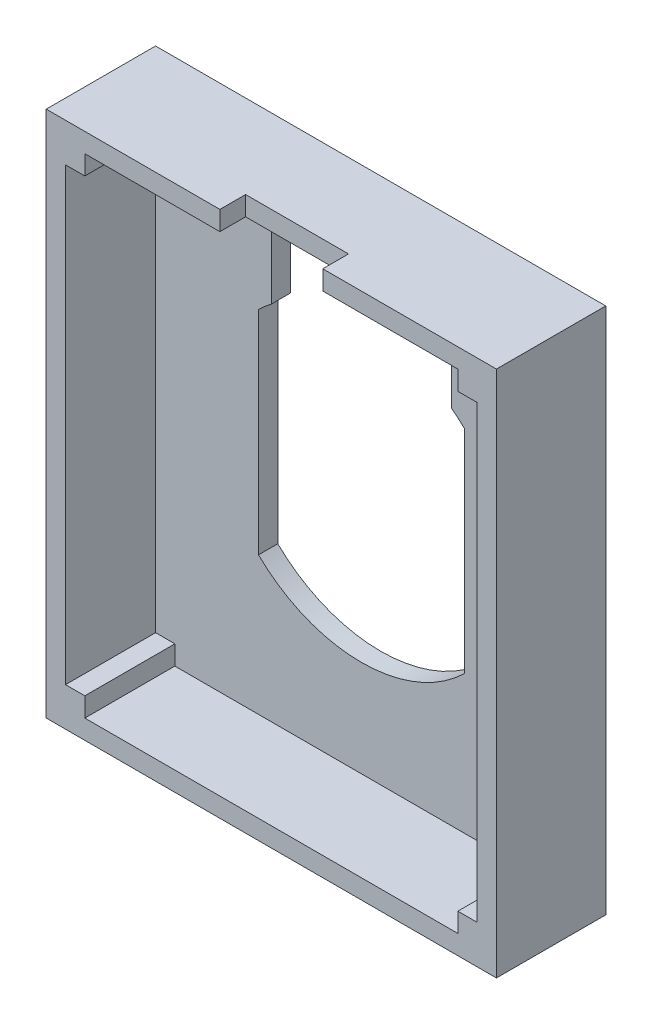
ISO-10303-21;
HEADER;
FILE_DESCRIPTION(('STEP AP214'),'2;1');
FILE_NAME('part.step','',(''),(''),'','','');
FILE_SCHEMA(('AUTOMOTIVE_DESIGN { 1 0 10303 214 1 1 1 1 }'));
ENDSEC;
DATA;
#1=APPLICATION_CONTEXT('core data for automotive mechanical design processes');
#2=APPLICATION_PROTOCOL_DEFINITION('international standard','automotive_design',2000,#1);
#3=PRODUCT_CONTEXT('',#1,'mechanical');
#4=PRODUCT('Part','Part','',(#3));
#5=PRODUCT_RELATED_PRODUCT_CATEGORY('part','',(#4));
#6=PRODUCT_DEFINITION_FORMATION('','',#4);
#7=PRODUCT_DEFINITION_CONTEXT('part definition',#1,'design');
#8=PRODUCT_DEFINITION('design','',#6,#7);
#9=PRODUCT_DEFINITION_SHAPE('','',#8);
#10=(LENGTH_UNIT() NAMED_UNIT(*) SI_UNIT(.MILLI.,.METRE.));
#11=(NAMED_UNIT(*) PLANE_ANGLE_UNIT() SI_UNIT($,.RADIAN.));
#12=(NAMED_UNIT(*) SI_UNIT($,.STERADIAN.) SOLID_ANGLE_UNIT());
#13=UNCERTAINTY_MEASURE_WITH_UNIT(LENGTH_MEASURE(1.E-05),#10,'distance_accuracy_value','');
#14=(GEOMETRIC_REPRESENTATION_CONTEXT(3) GLOBAL_UNCERTAINTY_ASSIGNED_CONTEXT((#13)) GLOBAL_UNIT_ASSIGNED_CONTEXT((#10,
#11,#12)) REPRESENTATION_CONTEXT('',''));
#15=CARTESIAN_POINT('',(0.,0.,0.));
#16=DIRECTION('',(0.,0.,1.));
#17=DIRECTION('',(1.,0.,0.));
#18=AXIS2_PLACEMENT_3D('',#15,#16,#17);
#19=CARTESIAN_POINT('',(0.,-20.5,1.5));
#20=DIRECTION('',(0.,-1.,0.));
#21=DIRECTION('',(1.,0.,0.));
#22=AXIS2_PLACEMENT_3D('',#19,#20,#21);
#23=PLANE('',#22);
#24=DIRECTION('',(-1.,0.,0.));
#25=VECTOR('',#24,1.);
#26=CARTESIAN_POINT('',(0.,-20.5,0.));
#27=LINE('',#26,#25);
#28=CARTESIAN_POINT('',(17.5,-20.5,0.));
#29=VERTEX_POINT('',#28);
#30=CARTESIAN_POINT('',(-17.5,-20.5,0.));
#31=VERTEX_POINT('',#30);
#32=EDGE_CURVE('E408',#29,#31,#27,.T.);
#33=ORIENTED_EDGE('',*,*,#32,.F.);
#34=DIRECTION('',(0.,0.,-1.));
#35=VECTOR('',#34,1.);
#36=CARTESIAN_POINT('',(17.5,-20.5,1.5));
#37=LINE('',#36,#35);
#38=CARTESIAN_POINT('',(17.5,-20.5,8.5));
#39=VERTEX_POINT('',#38);
#40=EDGE_CURVE('E11',#39,#29,#37,.T.);
#41=ORIENTED_EDGE('',*,*,#40,.F.);
#42=DIRECTION('',(1.,0.,0.));
#43=VECTOR('',#42,1.);
#44=CARTESIAN_POINT('',(0.,-20.5,8.5));
#45=LINE('',#44,#43);
#46=CARTESIAN_POINT('',(-17.5,-20.5,8.5));
#47=VERTEX_POINT('',#46);
#48=EDGE_CURVE('E295',#47,#39,#45,.T.);
#49=ORIENTED_EDGE('',*,*,#48,.F.);
#50=DIRECTION('',(0.,0.,-1.));
#51=VECTOR('',#50,1.);
#52=CARTESIAN_POINT('',(-17.5,-20.5,1.5));
#53=LINE('',#52,#51);
#54=EDGE_CURVE('E419',#47,#31,#53,.T.);
#55=ORIENTED_EDGE('',*,*,#54,.T.);
#56=EDGE_LOOP('',(#33,#41,#49,#55));
#57=FACE_BOUND('',#56,.T.);
#58=ADVANCED_FACE('F37',(#57),#23,.T.);
#59=CARTESIAN_POINT('',(17.5,0.,1.5));
#60=DIRECTION('',(-1.,0.,0.));
#61=DIRECTION('',(0.,0.,1.));
#62=AXIS2_PLACEMENT_3D('',#59,#60,#61);
#63=PLANE('',#62);
#64=DIRECTION('',(0.,1.,0.));
#65=VECTOR('',#64,1.);
#66=CARTESIAN_POINT('',(17.5,0.,0.));
#67=LINE('',#66,#65);
#68=CARTESIAN_POINT('',(17.5,20.5,0.));
#69=VERTEX_POINT('',#68);
#70=EDGE_CURVE('E411',#29,#69,#67,.T.);
#71=ORIENTED_EDGE('',*,*,#70,.T.);
#72=DIRECTION('',(0.,0.,-1.));
#73=VECTOR('',#72,1.);
#74=CARTESIAN_POINT('',(17.5,20.5,1.5));
#75=LINE('',#74,#73);
#76=CARTESIAN_POINT('',(17.5,20.5,8.5));
#77=VERTEX_POINT('',#76);
#78=EDGE_CURVE('E46',#77,#69,#75,.T.);
#79=ORIENTED_EDGE('',*,*,#78,.F.);
#80=DIRECTION('',(0.,1.,0.));
#81=VECTOR('',#80,1.);
#82=CARTESIAN_POINT('',(17.5,0.,8.5));
#83=LINE('',#82,#81);
#84=EDGE_CURVE('E298',#39,#77,#83,.T.);
#85=ORIENTED_EDGE('',*,*,#84,.F.);
#86=ORIENTED_EDGE('',*,*,#40,.T.);
#87=EDGE_LOOP('',(#71,#79,#85,#86));
#88=FACE_BOUND('',#87,.T.);
#89=ADVANCED_FACE('F488',(#88),#63,.F.);
#90=CARTESIAN_POINT('',(0.,20.5,1.5));
#91=DIRECTION('',(0.,-1.,0.));
#92=DIRECTION('',(1.,0.,0.));
#93=AXIS2_PLACEMENT_3D('',#90,#91,#92);
#94=PLANE('',#93);
#95=DIRECTION('',(-1.,0.,0.));
#96=VECTOR('',#95,1.);
#97=CARTESIAN_POINT('',(0.,20.5,8.5));
#98=LINE('',#97,#96);
#99=CARTESIAN_POINT('',(-4.,20.5,8.5));
#100=VERTEX_POINT('',#99);
#101=CARTESIAN_POINT('',(-17.5,20.5,8.5));
#102=VERTEX_POINT('',#101);
#103=EDGE_CURVE('E301',#100,#102,#98,.T.);
#104=ORIENTED_EDGE('',*,*,#103,.F.);
#105=DIRECTION('',(0.,0.,1.));
#106=VECTOR('',#105,1.);
#107=CARTESIAN_POINT('',(-4.,20.5,6.5));
#108=LINE('',#107,#106);
#109=CARTESIAN_POINT('',(-4.,20.5,6.5));
#110=VERTEX_POINT('',#109);
#111=EDGE_CURVE('E254',#110,#100,#108,.T.);
#112=ORIENTED_EDGE('',*,*,#111,.F.);
#113=DIRECTION('',(-1.,0.,0.));
#114=VECTOR('',#113,1.);
#115=CARTESIAN_POINT('',(4.,20.5,6.5));
#116=LINE('',#115,#114);
#117=CARTESIAN_POINT('',(4.,20.5,6.5));
#118=VERTEX_POINT('',#117);
#119=EDGE_CURVE('E234',#118,#110,#116,.T.);
#120=ORIENTED_EDGE('',*,*,#119,.F.);
#121=DIRECTION('',(0.,0.,1.));
#122=VECTOR('',#121,1.);
#123=CARTESIAN_POINT('',(4.,20.5,6.5));
#124=LINE('',#123,#122);
#125=CARTESIAN_POINT('',(4.,20.5,8.5));
#126=VERTEX_POINT('',#125);
#127=EDGE_CURVE('E257',#118,#126,#124,.T.);
#128=ORIENTED_EDGE('',*,*,#127,.T.);
#129=EDGE_CURVE('E302',#77,#126,#98,.T.);
#130=ORIENTED_EDGE('',*,*,#129,.F.);
#131=ORIENTED_EDGE('',*,*,#78,.T.);
#132=DIRECTION('',(-1.,0.,0.));
#133=VECTOR('',#132,1.);
#134=CARTESIAN_POINT('',(0.,20.5,0.));
#135=LINE('',#134,#133);
#136=CARTESIAN_POINT('',(-17.5,20.5,0.));
#137=VERTEX_POINT('',#136);
#138=EDGE_CURVE('E414',#69,#137,#135,.T.);
#139=ORIENTED_EDGE('',*,*,#138,.T.);
#140=DIRECTION('',(0.,0.,-1.));
#141=VECTOR('',#140,1.);
#142=CARTESIAN_POINT('',(-17.5,20.5,1.5));
#143=LINE('',#142,#141);
#144=EDGE_CURVE('E421',#102,#137,#143,.T.);
#145=ORIENTED_EDGE('',*,*,#144,.F.);
#146=EDGE_LOOP('',(#104,#112,#120,#128,#130,#131,#139,#145));
#147=FACE_BOUND('',#146,.T.);
#148=ADVANCED_FACE('F494',(#147),#94,.F.);
#149=CARTESIAN_POINT('',(0.,0.,1.5));
#150=DIRECTION('',(0.,0.,-1.));
#151=DIRECTION('',(-1.,0.,0.));
#152=AXIS2_PLACEMENT_3D('',#149,#150,#151);
#153=CYLINDRICAL_SURFACE('',#152,11.5);
#154=CARTESIAN_POINT('',(0.,0.,0.));
#155=DIRECTION('',(0.,0.,1.));
#156=DIRECTION('',(1.,0.,0.));
#157=AXIS2_PLACEMENT_3D('',#154,#155,#156);
#158=CIRCLE('',#157,11.5);
#159=CARTESIAN_POINT('',(-8.,-8.26135582092916,0.));
#160=VERTEX_POINT('',#159);
#161=CARTESIAN_POINT('',(8.,-8.26135582092916,0.));
#162=VERTEX_POINT('',#161);
#163=EDGE_CURVE('E360',#160,#162,#158,.T.);
#164=ORIENTED_EDGE('',*,*,#163,.F.);
#165=DIRECTION('',(0.,0.,-1.));
#166=VECTOR('',#165,1.);
#167=CARTESIAN_POINT('',(-8.,-8.26135582092916,1.5));
#168=LINE('',#167,#166);
#169=CARTESIAN_POINT('',(-8.,-8.26135582092916,1.5));
#170=VERTEX_POINT('',#169);
#171=EDGE_CURVE('E41',#170,#160,#168,.T.);
#172=ORIENTED_EDGE('',*,*,#171,.F.);
#173=CARTESIAN_POINT('',(0.,0.,1.5));
#174=DIRECTION('',(0.,0.,1.));
#175=DIRECTION('',(1.,0.,0.));
#176=AXIS2_PLACEMENT_3D('',#173,#174,#175);
#177=CIRCLE('',#176,11.5);
#178=CARTESIAN_POINT('',(8.,-8.26135582092916,1.5));
#179=VERTEX_POINT('',#178);
#180=EDGE_CURVE('E361',#170,#179,#177,.T.);
#181=ORIENTED_EDGE('',*,*,#180,.T.);
#182=DIRECTION('',(0.,0.,-1.));
#183=VECTOR('',#182,1.);
#184=CARTESIAN_POINT('',(8.,-8.26135582092916,1.5));
#185=LINE('',#184,#183);
#186=EDGE_CURVE('E384',#179,#162,#185,.T.);
#187=ORIENTED_EDGE('',*,*,#186,.T.);
#188=EDGE_LOOP('',(#164,#172,#181,#187));
#189=FACE_BOUND('',#188,.T.);
#190=ADVANCED_FACE('F39',(#189),#153,.F.);
#191=CARTESIAN_POINT('',(-8.,0.,1.5));
#192=DIRECTION('',(-1.,0.,0.));
#193=DIRECTION('',(0.,0.,1.));
#194=AXIS2_PLACEMENT_3D('',#191,#192,#193);
#195=PLANE('',#194);
#196=DIRECTION('',(0.,1.,0.));
#197=VECTOR('',#196,1.);
#198=CARTESIAN_POINT('',(-8.,0.,0.));
#199=LINE('',#198,#197);
#200=CARTESIAN_POINT('',(-8.,8.26135582092916,0.));
#201=VERTEX_POINT('',#200);
#202=EDGE_CURVE('E387',#160,#201,#199,.T.);
#203=ORIENTED_EDGE('',*,*,#202,.T.);
#204=DIRECTION('',(0.,0.,-1.));
#205=VECTOR('',#204,1.);
#206=CARTESIAN_POINT('',(-8.,8.26135582092916,1.5));
#207=LINE('',#206,#205);
#208=CARTESIAN_POINT('',(-8.,8.26135582092916,1.5));
#209=VERTEX_POINT('',#208);
#210=EDGE_CURVE('E435',#209,#201,#207,.T.);
#211=ORIENTED_EDGE('',*,*,#210,.F.);
#212=DIRECTION('',(0.,1.,0.));
#213=VECTOR('',#212,1.);
#214=CARTESIAN_POINT('',(-8.,0.,1.5));
#215=LINE('',#214,#213);
#216=EDGE_CURVE('E364',#170,#209,#215,.T.);
#217=ORIENTED_EDGE('',*,*,#216,.F.);
#218=ORIENTED_EDGE('',*,*,#171,.T.);
#219=EDGE_LOOP('',(#203,#211,#217,#218));
#220=FACE_BOUND('',#219,.T.);
#221=ADVANCED_FACE('F442',(#220),#195,.F.);
#222=CARTESIAN_POINT('',(0.,0.,1.5));
#223=DIRECTION('',(0.,0.,-1.));
#224=DIRECTION('',(-1.,0.,0.));
#225=AXIS2_PLACEMENT_3D('',#222,#223,#224);
#226=CYLINDRICAL_SURFACE('',#225,11.5);
#227=CARTESIAN_POINT('',(0.,0.,0.));
#228=DIRECTION('',(0.,0.,1.));
#229=DIRECTION('',(1.,0.,0.));
#230=AXIS2_PLACEMENT_3D('',#227,#228,#229);
#231=CIRCLE('',#230,11.5);
#232=CARTESIAN_POINT('',(-7.,9.12414379544733,0.));
#233=VERTEX_POINT('',#232);
#234=EDGE_CURVE('E390',#233,#201,#231,.T.);
#235=ORIENTED_EDGE('',*,*,#234,.F.);
#236=DIRECTION('',(0.,0.,-1.));
#237=VECTOR('',#236,1.);
#238=CARTESIAN_POINT('',(-7.,9.12414379544733,1.5));
#239=LINE('',#238,#237);
#240=CARTESIAN_POINT('',(-7.,9.12414379544733,1.5));
#241=VERTEX_POINT('',#240);
#242=EDGE_CURVE('E434',#241,#233,#239,.T.);
#243=ORIENTED_EDGE('',*,*,#242,.F.);
#244=CARTESIAN_POINT('',(0.,0.,1.5));
#245=DIRECTION('',(0.,0.,1.));
#246=DIRECTION('',(1.,0.,0.));
#247=AXIS2_PLACEMENT_3D('',#244,#245,#246);
#248=CIRCLE('',#247,11.5);
#249=EDGE_CURVE('E367',#241,#209,#248,.T.);
#250=ORIENTED_EDGE('',*,*,#249,.T.);
#251=ORIENTED_EDGE('',*,*,#210,.T.);
#252=EDGE_LOOP('',(#235,#243,#250,#251));
#253=FACE_BOUND('',#252,.T.);
#254=ADVANCED_FACE('F468',(#253),#226,.F.);
#255=CARTESIAN_POINT('',(-7.00000000000001,0.,1.5));
#256=DIRECTION('',(-1.,0.,0.));
#257=DIRECTION('',(0.,-1.,0.));
#258=AXIS2_PLACEMENT_3D('',#255,#256,#257);
#259=PLANE('',#258);
#260=DIRECTION('',(0.,1.,0.));
#261=VECTOR('',#260,1.);
#262=CARTESIAN_POINT('',(-7.00000000000001,0.,0.));
#263=LINE('',#262,#261);
#264=CARTESIAN_POINT('',(-7.,15.,0.));
#265=VERTEX_POINT('',#264);
#266=EDGE_CURVE('E393',#233,#265,#263,.T.);
#267=ORIENTED_EDGE('',*,*,#266,.T.);
#268=DIRECTION('',(0.,0.,-1.));
#269=VECTOR('',#268,1.);
#270=CARTESIAN_POINT('',(-7.,15.,1.5));
#271=LINE('',#270,#269);
#272=CARTESIAN_POINT('',(-7.,15.,1.5));
#273=VERTEX_POINT('',#272);
#274=EDGE_CURVE('E432',#273,#265,#271,.T.);
#275=ORIENTED_EDGE('',*,*,#274,.F.);
#276=DIRECTION('',(0.,1.,0.));
#277=VECTOR('',#276,1.);
#278=CARTESIAN_POINT('',(-7.00000000000001,0.,1.5));
#279=LINE('',#278,#277);
#280=EDGE_CURVE('E370',#241,#273,#279,.T.);
#281=ORIENTED_EDGE('',*,*,#280,.F.);
#282=ORIENTED_EDGE('',*,*,#242,.T.);
#283=EDGE_LOOP('',(#267,#275,#281,#282));
#284=FACE_BOUND('',#283,.T.);
#285=ADVANCED_FACE('F471',(#284),#259,.F.);
#286=CARTESIAN_POINT('',(0.,15.,1.5));
#287=DIRECTION('',(0.,-1.,0.));
#288=DIRECTION('',(1.,0.,0.));
#289=AXIS2_PLACEMENT_3D('',#286,#287,#288);
#290=PLANE('',#289);
#291=DIRECTION('',(-1.,0.,0.));
#292=VECTOR('',#291,1.);
#293=CARTESIAN_POINT('',(0.,15.,0.));
#294=LINE('',#293,#292);
#295=CARTESIAN_POINT('',(7.,15.,0.));
#296=VERTEX_POINT('',#295);
#297=EDGE_CURVE('E396',#296,#265,#294,.T.);
#298=ORIENTED_EDGE('',*,*,#297,.F.);
#299=DIRECTION('',(0.,0.,-1.));
#300=VECTOR('',#299,1.);
#301=CARTESIAN_POINT('',(7.,15.,1.5));
#302=LINE('',#301,#300);
#303=CARTESIAN_POINT('',(7.,15.,1.5));
#304=VERTEX_POINT('',#303);
#305=EDGE_CURVE('E430',#304,#296,#302,.T.);
#306=ORIENTED_EDGE('',*,*,#305,.F.);
#307=DIRECTION('',(-1.,0.,0.));
#308=VECTOR('',#307,1.);
#309=CARTESIAN_POINT('',(0.,15.,1.5));
#310=LINE('',#309,#308);
#311=EDGE_CURVE('E372',#304,#273,#310,.T.);
#312=ORIENTED_EDGE('',*,*,#311,.T.);
#313=ORIENTED_EDGE('',*,*,#274,.T.);
#314=EDGE_LOOP('',(#298,#306,#312,#313));
#315=FACE_BOUND('',#314,.T.);
#316=ADVANCED_FACE('F465',(#315),#290,.T.);
#317=CARTESIAN_POINT('',(7.00000000000001,0.,1.5));
#318=DIRECTION('',(-1.,0.,0.));
#319=DIRECTION('',(0.,-1.,0.));
#320=AXIS2_PLACEMENT_3D('',#317,#318,#319);
#321=PLANE('',#320);
#322=DIRECTION('',(0.,1.,0.));
#323=VECTOR('',#322,1.);
#324=CARTESIAN_POINT('',(7.00000000000001,0.,0.));
#325=LINE('',#324,#323);
#326=CARTESIAN_POINT('',(7.,9.12414379544733,0.));
#327=VERTEX_POINT('',#326);
#328=EDGE_CURVE('E399',#327,#296,#325,.T.);
#329=ORIENTED_EDGE('',*,*,#328,.F.);
#330=DIRECTION('',(0.,0.,-1.));
#331=VECTOR('',#330,1.);
#332=CARTESIAN_POINT('',(7.,9.12414379544733,1.5));
#333=LINE('',#332,#331);
#334=CARTESIAN_POINT('',(7.,9.12414379544733,1.5));
#335=VERTEX_POINT('',#334);
#336=EDGE_CURVE('E428',#335,#327,#333,.T.);
#337=ORIENTED_EDGE('',*,*,#336,.F.);
#338=DIRECTION('',(0.,1.,0.));
#339=VECTOR('',#338,1.);
#340=CARTESIAN_POINT('',(7.00000000000001,0.,1.5));
#341=LINE('',#340,#339);
#342=EDGE_CURVE('E375',#335,#304,#341,.T.);
#343=ORIENTED_EDGE('',*,*,#342,.T.);
#344=ORIENTED_EDGE('',*,*,#305,.T.);
#345=EDGE_LOOP('',(#329,#337,#343,#344));
#346=FACE_BOUND('',#345,.T.);
#347=ADVANCED_FACE('F461',(#346),#321,.T.);
#348=CARTESIAN_POINT('',(0.,0.,1.5));
#349=DIRECTION('',(0.,0.,-1.));
#350=DIRECTION('',(-1.,0.,0.));
#351=AXIS2_PLACEMENT_3D('',#348,#349,#350);
#352=CYLINDRICAL_SURFACE('',#351,11.5);
#353=CARTESIAN_POINT('',(0.,0.,0.));
#354=DIRECTION('',(0.,0.,1.));
#355=DIRECTION('',(1.,0.,0.));
#356=AXIS2_PLACEMENT_3D('',#353,#354,#355);
#357=CIRCLE('',#356,11.5);
#358=CARTESIAN_POINT('',(8.,8.26135582092916,0.));
#359=VERTEX_POINT('',#358);
#360=EDGE_CURVE('E402',#359,#327,#357,.T.);
#361=ORIENTED_EDGE('',*,*,#360,.F.);
#362=DIRECTION('',(0.,0.,-1.));
#363=VECTOR('',#362,1.);
#364=CARTESIAN_POINT('',(8.,8.26135582092916,1.5));
#365=LINE('',#364,#363);
#366=CARTESIAN_POINT('',(8.,8.26135582092916,1.5));
#367=VERTEX_POINT('',#366);
#368=EDGE_CURVE('E426',#367,#359,#365,.T.);
#369=ORIENTED_EDGE('',*,*,#368,.F.);
#370=CARTESIAN_POINT('',(0.,0.,1.5));
#371=DIRECTION('',(0.,0.,1.));
#372=DIRECTION('',(1.,0.,0.));
#373=AXIS2_PLACEMENT_3D('',#370,#371,#372);
#374=CIRCLE('',#373,11.5);
#375=EDGE_CURVE('E378',#367,#335,#374,.T.);
#376=ORIENTED_EDGE('',*,*,#375,.T.);
#377=ORIENTED_EDGE('',*,*,#336,.T.);
#378=EDGE_LOOP('',(#361,#369,#376,#377));
#379=FACE_BOUND('',#378,.T.);
#380=ADVANCED_FACE('F457',(#379),#352,.F.);
#381=CARTESIAN_POINT('',(8.,0.,1.5));
#382=DIRECTION('',(-1.,0.,0.));
#383=DIRECTION('',(0.,0.,1.));
#384=AXIS2_PLACEMENT_3D('',#381,#382,#383);
#385=PLANE('',#384);
#386=DIRECTION('',(0.,1.,0.));
#387=VECTOR('',#386,1.);
#388=CARTESIAN_POINT('',(8.,0.,0.));
#389=LINE('',#388,#387);
#390=EDGE_CURVE('E405',#162,#359,#389,.T.);
#391=ORIENTED_EDGE('',*,*,#390,.F.);
#392=ORIENTED_EDGE('',*,*,#186,.F.);
#393=DIRECTION('',(0.,1.,0.));
#394=VECTOR('',#393,1.);
#395=CARTESIAN_POINT('',(8.,0.,1.5));
#396=LINE('',#395,#394);
#397=EDGE_CURVE('E381',#179,#367,#396,.T.);
#398=ORIENTED_EDGE('',*,*,#397,.T.);
#399=ORIENTED_EDGE('',*,*,#368,.T.);
#400=EDGE_LOOP('',(#391,#392,#398,#399));
#401=FACE_BOUND('',#400,.T.);
#402=ADVANCED_FACE('F453',(#401),#385,.T.);
#403=CARTESIAN_POINT('',(-17.5,0.,1.5));
#404=DIRECTION('',(-1.,0.,0.));
#405=DIRECTION('',(0.,-1.,0.));
#406=AXIS2_PLACEMENT_3D('',#403,#404,#405);
#407=PLANE('',#406);
#408=DIRECTION('',(0.,1.,0.));
#409=VECTOR('',#408,1.);
#410=CARTESIAN_POINT('',(-17.5,0.,0.));
#411=LINE('',#410,#409);
#412=EDGE_CURVE('E365',#31,#137,#411,.T.);
#413=ORIENTED_EDGE('',*,*,#412,.F.);
#414=ORIENTED_EDGE('',*,*,#54,.F.);
#415=DIRECTION('',(0.,-1.,0.));
#416=VECTOR('',#415,1.);
#417=CARTESIAN_POINT('',(-17.5,0.,8.5));
#418=LINE('',#417,#416);
#419=EDGE_CURVE('E292',#102,#47,#418,.T.);
#420=ORIENTED_EDGE('',*,*,#419,.F.);
#421=ORIENTED_EDGE('',*,*,#144,.T.);
#422=EDGE_LOOP('',(#413,#414,#420,#421));
#423=FACE_BOUND('',#422,.T.);
#424=ADVANCED_FACE('F475',(#423),#407,.T.);
#425=CARTESIAN_POINT('',(0.,0.,1.5));
#426=DIRECTION('',(0.,0.,1.));
#427=DIRECTION('',(1.,0.,0.));
#428=AXIS2_PLACEMENT_3D('',#425,#426,#427);
#429=PLANE('',#428);
#430=DIRECTION('',(1.,0.,0.));
#431=VECTOR('',#430,1.);
#432=CARTESIAN_POINT('',(0.,-17.5,1.5));
#433=LINE('',#432,#431);
#434=CARTESIAN_POINT('',(-16.,-17.5,1.5));
#435=VERTEX_POINT('',#434);
#436=CARTESIAN_POINT('',(-14.5,-17.5,1.5));
#437=VERTEX_POINT('',#436);
#438=EDGE_CURVE('E256',#435,#437,#433,.T.);
#439=ORIENTED_EDGE('',*,*,#438,.T.);
#440=DIRECTION('',(0.,1.,0.));
#441=VECTOR('',#440,1.);
#442=CARTESIAN_POINT('',(-14.5,0.,1.5));
#443=LINE('',#442,#441);
#444=CARTESIAN_POINT('',(-14.5,-19.,1.5));
#445=VERTEX_POINT('',#444);
#446=EDGE_CURVE('E265',#445,#437,#443,.T.);
#447=ORIENTED_EDGE('',*,*,#446,.F.);
#448=DIRECTION('',(-1.,0.,0.));
#449=VECTOR('',#448,1.);
#450=CARTESIAN_POINT('',(0.,-19.,1.5));
#451=LINE('',#450,#449);
#452=CARTESIAN_POINT('',(14.5,-19.,1.5));
#453=VERTEX_POINT('',#452);
#454=EDGE_CURVE('E334',#453,#445,#451,.T.);
#455=ORIENTED_EDGE('',*,*,#454,.F.);
#456=DIRECTION('',(0.,1.,0.));
#457=VECTOR('',#456,1.);
#458=CARTESIAN_POINT('',(14.5,0.,1.5));
#459=LINE('',#458,#457);
#460=CARTESIAN_POINT('',(14.5,-17.5,1.5));
#461=VERTEX_POINT('',#460);
#462=EDGE_CURVE('E331',#453,#461,#459,.T.);
#463=ORIENTED_EDGE('',*,*,#462,.T.);
#464=DIRECTION('',(-1.,0.,0.));
#465=VECTOR('',#464,1.);
#466=CARTESIAN_POINT('',(0.,-17.5,1.5));
#467=LINE('',#466,#465);
#468=CARTESIAN_POINT('',(16.,-17.5,1.5));
#469=VERTEX_POINT('',#468);
#470=EDGE_CURVE('E328',#469,#461,#467,.T.);
#471=ORIENTED_EDGE('',*,*,#470,.F.);
#472=DIRECTION('',(0.,1.,0.));
#473=VECTOR('',#472,1.);
#474=CARTESIAN_POINT('',(16.,0.,1.5));
#475=LINE('',#474,#473);
#476=CARTESIAN_POINT('',(16.,17.5,1.5));
#477=VERTEX_POINT('',#476);
#478=EDGE_CURVE('E325',#469,#477,#475,.T.);
#479=ORIENTED_EDGE('',*,*,#478,.T.);
#480=DIRECTION('',(-1.,0.,0.));
#481=VECTOR('',#480,1.);
#482=CARTESIAN_POINT('',(0.,17.5,1.5));
#483=LINE('',#482,#481);
#484=CARTESIAN_POINT('',(14.5,17.5,1.5));
#485=VERTEX_POINT('',#484);
#486=EDGE_CURVE('E322',#477,#485,#483,.T.);
#487=ORIENTED_EDGE('',*,*,#486,.T.);
#488=DIRECTION('',(0.,-1.,0.));
#489=VECTOR('',#488,1.);
#490=CARTESIAN_POINT('',(14.5,0.,1.5));
#491=LINE('',#490,#489);
#492=CARTESIAN_POINT('',(14.5,19.,1.5));
#493=VERTEX_POINT('',#492);
#494=EDGE_CURVE('E319',#493,#485,#491,.T.);
#495=ORIENTED_EDGE('',*,*,#494,.F.);
#496=DIRECTION('',(-1.,0.,0.));
#497=VECTOR('',#496,1.);
#498=CARTESIAN_POINT('',(0.,19.,1.5));
#499=LINE('',#498,#497);
#500=CARTESIAN_POINT('',(-14.5,19.,1.5));
#501=VERTEX_POINT('',#500);
#502=EDGE_CURVE('E316',#493,#501,#499,.T.);
#503=ORIENTED_EDGE('',*,*,#502,.T.);
#504=DIRECTION('',(0.,-1.,0.));
#505=VECTOR('',#504,1.);
#506=CARTESIAN_POINT('',(-14.5,0.,1.5));
#507=LINE('',#506,#505);
#508=CARTESIAN_POINT('',(-14.5,17.5,1.5));
#509=VERTEX_POINT('',#508);
#510=EDGE_CURVE('E313',#501,#509,#507,.T.);
#511=ORIENTED_EDGE('',*,*,#510,.T.);
#512=DIRECTION('',(1.,0.,0.));
#513=VECTOR('',#512,1.);
#514=CARTESIAN_POINT('',(0.,17.5,1.5));
#515=LINE('',#514,#513);
#516=CARTESIAN_POINT('',(-16.,17.5,1.5));
#517=VERTEX_POINT('',#516);
#518=EDGE_CURVE('E310',#517,#509,#515,.T.);
#519=ORIENTED_EDGE('',*,*,#518,.F.);
#520=DIRECTION('',(0.,1.,0.));
#521=VECTOR('',#520,1.);
#522=CARTESIAN_POINT('',(-16.,0.,1.5));
#523=LINE('',#522,#521);
#524=EDGE_CURVE('E308',#435,#517,#523,.T.);
#525=ORIENTED_EDGE('',*,*,#524,.F.);
#526=EDGE_LOOP('',(#439,#447,#455,#463,#471,#479,#487,#495,#503,#511,#519,#525));
#527=FACE_BOUND('',#526,.T.);
#528=ORIENTED_EDGE('',*,*,#180,.F.);
#529=ORIENTED_EDGE('',*,*,#216,.T.);
#530=ORIENTED_EDGE('',*,*,#249,.F.);
#531=ORIENTED_EDGE('',*,*,#280,.T.);
#532=ORIENTED_EDGE('',*,*,#311,.F.);
#533=ORIENTED_EDGE('',*,*,#342,.F.);
#534=ORIENTED_EDGE('',*,*,#375,.F.);
#535=ORIENTED_EDGE('',*,*,#397,.F.);
#536=EDGE_LOOP('',(#528,#529,#530,#531,#532,#533,#534,#535));
#537=FACE_BOUND('',#536,.T.);
#538=ADVANCED_FACE('F473',(#527,#537),#429,.T.);
#539=CARTESIAN_POINT('',(0.,0.,0.));
#540=DIRECTION('',(0.,0.,1.));
#541=DIRECTION('',(1.,0.,0.));
#542=AXIS2_PLACEMENT_3D('',#539,#540,#541);
#543=PLANE('',#542);
#544=ORIENTED_EDGE('',*,*,#163,.T.);
#545=ORIENTED_EDGE('',*,*,#390,.T.);
#546=ORIENTED_EDGE('',*,*,#360,.T.);
#547=ORIENTED_EDGE('',*,*,#328,.T.);
#548=ORIENTED_EDGE('',*,*,#297,.T.);
#549=ORIENTED_EDGE('',*,*,#266,.F.);
#550=ORIENTED_EDGE('',*,*,#234,.T.);
#551=ORIENTED_EDGE('',*,*,#202,.F.);
#552=EDGE_LOOP('',(#544,#545,#546,#547,#548,#549,#550,#551));
#553=FACE_BOUND('',#552,.T.);
#554=ORIENTED_EDGE('',*,*,#32,.T.);
#555=ORIENTED_EDGE('',*,*,#412,.T.);
#556=ORIENTED_EDGE('',*,*,#138,.F.);
#557=ORIENTED_EDGE('',*,*,#70,.F.);
#558=EDGE_LOOP('',(#554,#555,#556,#557));
#559=FACE_BOUND('',#558,.T.);
#560=ADVANCED_FACE('F447',(#553,#559),#543,.F.);
#561=CARTESIAN_POINT('',(0.,-17.5,8.5));
#562=DIRECTION('',(0.,1.,0.));
#563=DIRECTION('',(-1.,0.,0.));
#564=AXIS2_PLACEMENT_3D('',#561,#562,#563);
#565=PLANE('',#564);
#566=ORIENTED_EDGE('',*,*,#438,.F.);
#567=DIRECTION('',(0.,0.,-1.));
#568=VECTOR('',#567,1.);
#569=CARTESIAN_POINT('',(-16.,-17.5,8.5));
#570=LINE('',#569,#568);
#571=CARTESIAN_POINT('',(-16.,-17.5,8.5));
#572=VERTEX_POINT('',#571);
#573=EDGE_CURVE('E358',#572,#435,#570,.T.);
#574=ORIENTED_EDGE('',*,*,#573,.F.);
#575=DIRECTION('',(1.,0.,0.));
#576=VECTOR('',#575,1.);
#577=CARTESIAN_POINT('',(0.,-17.5,8.5));
#578=LINE('',#577,#576);
#579=CARTESIAN_POINT('',(-14.5,-17.5,8.5));
#580=VERTEX_POINT('',#579);
#581=EDGE_CURVE('E261',#572,#580,#578,.T.);
#582=ORIENTED_EDGE('',*,*,#581,.T.);
#583=DIRECTION('',(0.,0.,-1.));
#584=VECTOR('',#583,1.);
#585=CARTESIAN_POINT('',(-14.5,-17.5,8.5));
#586=LINE('',#585,#584);
#587=EDGE_CURVE('E305',#580,#437,#586,.T.);
#588=ORIENTED_EDGE('',*,*,#587,.T.);
#589=EDGE_LOOP('',(#566,#574,#582,#588));
#590=FACE_BOUND('',#589,.T.);
#591=ADVANCED_FACE('F482',(#590),#565,.T.);
#592=CARTESIAN_POINT('',(-16.,0.,8.5));
#593=DIRECTION('',(-1.,0.,0.));
#594=DIRECTION('',(0.,0.,1.));
#595=AXIS2_PLACEMENT_3D('',#592,#593,#594);
#596=PLANE('',#595);
#597=ORIENTED_EDGE('',*,*,#524,.T.);
#598=DIRECTION('',(0.,0.,-1.));
#599=VECTOR('',#598,1.);
#600=CARTESIAN_POINT('',(-16.,17.5,8.5));
#601=LINE('',#600,#599);
#602=CARTESIAN_POINT('',(-16.,17.5,8.5));
#603=VERTEX_POINT('',#602);
#604=EDGE_CURVE('E355',#603,#517,#601,.T.);
#605=ORIENTED_EDGE('',*,*,#604,.F.);
#606=DIRECTION('',(0.,1.,0.));
#607=VECTOR('',#606,1.);
#608=CARTESIAN_POINT('',(-16.,0.,8.5));
#609=LINE('',#608,#607);
#610=EDGE_CURVE('E264',#572,#603,#609,.T.);
#611=ORIENTED_EDGE('',*,*,#610,.F.);
#612=ORIENTED_EDGE('',*,*,#573,.T.);
#613=EDGE_LOOP('',(#597,#605,#611,#612));
#614=FACE_BOUND('',#613,.T.);
#615=ADVANCED_FACE('F590',(#614),#596,.F.);
#616=CARTESIAN_POINT('',(0.,17.5,8.5));
#617=DIRECTION('',(0.,1.,0.));
#618=DIRECTION('',(-1.,0.,0.));
#619=AXIS2_PLACEMENT_3D('',#616,#617,#618);
#620=PLANE('',#619);
#621=ORIENTED_EDGE('',*,*,#518,.T.);
#622=DIRECTION('',(0.,0.,-1.));
#623=VECTOR('',#622,1.);
#624=CARTESIAN_POINT('',(-14.5,17.5,8.5));
#625=LINE('',#624,#623);
#626=CARTESIAN_POINT('',(-14.5,17.5,8.5));
#627=VERTEX_POINT('',#626);
#628=EDGE_CURVE('E353',#627,#509,#625,.T.);
#629=ORIENTED_EDGE('',*,*,#628,.F.);
#630=DIRECTION('',(1.,0.,0.));
#631=VECTOR('',#630,1.);
#632=CARTESIAN_POINT('',(0.,17.5,8.5));
#633=LINE('',#632,#631);
#634=EDGE_CURVE('E267',#603,#627,#633,.T.);
#635=ORIENTED_EDGE('',*,*,#634,.F.);
#636=ORIENTED_EDGE('',*,*,#604,.T.);
#637=EDGE_LOOP('',(#621,#629,#635,#636));
#638=FACE_BOUND('',#637,.T.);
#639=ADVANCED_FACE('F587',(#638),#620,.F.);
#640=CARTESIAN_POINT('',(-14.5,0.,8.5));
#641=DIRECTION('',(1.,0.,0.));
#642=DIRECTION('',(0.,0.,-1.));
#643=AXIS2_PLACEMENT_3D('',#640,#641,#642);
#644=PLANE('',#643);
#645=ORIENTED_EDGE('',*,*,#510,.F.);
#646=DIRECTION('',(0.,0.,-1.));
#647=VECTOR('',#646,1.);
#648=CARTESIAN_POINT('',(-14.5,19.,8.5));
#649=LINE('',#648,#647);
#650=CARTESIAN_POINT('',(-14.5,19.,8.5));
#651=VERTEX_POINT('',#650);
#652=EDGE_CURVE('E351',#651,#501,#649,.T.);
#653=ORIENTED_EDGE('',*,*,#652,.F.);
#654=DIRECTION('',(0.,-1.,0.));
#655=VECTOR('',#654,1.);
#656=CARTESIAN_POINT('',(-14.5,0.,8.5));
#657=LINE('',#656,#655);
#658=EDGE_CURVE('E269',#651,#627,#657,.T.);
#659=ORIENTED_EDGE('',*,*,#658,.T.);
#660=ORIENTED_EDGE('',*,*,#628,.T.);
#661=EDGE_LOOP('',(#645,#653,#659,#660));
#662=FACE_BOUND('',#661,.T.);
#663=ADVANCED_FACE('F531',(#662),#644,.T.);
#664=CARTESIAN_POINT('',(0.,19.,8.5));
#665=DIRECTION('',(0.,-1.,0.));
#666=DIRECTION('',(0.,0.,-1.));
#667=AXIS2_PLACEMENT_3D('',#664,#665,#666);
#668=PLANE('',#667);
#669=DIRECTION('',(0.,0.,1.));
#670=VECTOR('',#669,1.);
#671=CARTESIAN_POINT('',(-4.,19.,6.5));
#672=LINE('',#671,#670);
#673=CARTESIAN_POINT('',(-4.,19.,6.5));
#674=VERTEX_POINT('',#673);
#675=CARTESIAN_POINT('',(-4.,19.,8.5));
#676=VERTEX_POINT('',#675);
#677=EDGE_CURVE('E224',#674,#676,#672,.T.);
#678=ORIENTED_EDGE('',*,*,#677,.T.);
#679=DIRECTION('',(-1.,0.,0.));
#680=VECTOR('',#679,1.);
#681=CARTESIAN_POINT('',(0.,19.,8.5));
#682=LINE('',#681,#680);
#683=EDGE_CURVE('E272',#676,#651,#682,.T.);
#684=ORIENTED_EDGE('',*,*,#683,.T.);
#685=ORIENTED_EDGE('',*,*,#652,.T.);
#686=ORIENTED_EDGE('',*,*,#502,.F.);
#687=DIRECTION('',(0.,0.,-1.));
#688=VECTOR('',#687,1.);
#689=CARTESIAN_POINT('',(14.5,19.,8.5));
#690=LINE('',#689,#688);
#691=CARTESIAN_POINT('',(14.5,19.,8.5));
#692=VERTEX_POINT('',#691);
#693=EDGE_CURVE('E349',#692,#493,#690,.T.);
#694=ORIENTED_EDGE('',*,*,#693,.F.);
#695=CARTESIAN_POINT('',(4.,19.,8.5));
#696=VERTEX_POINT('',#695);
#697=EDGE_CURVE('E273',#692,#696,#682,.T.);
#698=ORIENTED_EDGE('',*,*,#697,.T.);
#699=DIRECTION('',(0.,0.,1.));
#700=VECTOR('',#699,1.);
#701=CARTESIAN_POINT('',(4.,19.,6.5));
#702=LINE('',#701,#700);
#703=CARTESIAN_POINT('',(4.,19.,6.5));
#704=VERTEX_POINT('',#703);
#705=EDGE_CURVE('E54',#704,#696,#702,.T.);
#706=ORIENTED_EDGE('',*,*,#705,.F.);
#707=DIRECTION('',(1.,0.,0.));
#708=VECTOR('',#707,1.);
#709=CARTESIAN_POINT('',(-4.,19.,6.5));
#710=LINE('',#709,#708);
#711=EDGE_CURVE('E240',#674,#704,#710,.T.);
#712=ORIENTED_EDGE('',*,*,#711,.F.);
#713=EDGE_LOOP('',(#678,#684,#685,#686,#694,#698,#706,#712));
#714=FACE_BOUND('',#713,.T.);
#715=ADVANCED_FACE('F245',(#714),#668,.T.);
#716=CARTESIAN_POINT('',(14.5,0.,8.5));
#717=DIRECTION('',(1.,0.,0.));
#718=DIRECTION('',(0.,0.,-1.));
#719=AXIS2_PLACEMENT_3D('',#716,#717,#718);
#720=PLANE('',#719);
#721=ORIENTED_EDGE('',*,*,#494,.T.);
#722=DIRECTION('',(0.,0.,-1.));
#723=VECTOR('',#722,1.);
#724=CARTESIAN_POINT('',(14.5,17.5,8.5));
#725=LINE('',#724,#723);
#726=CARTESIAN_POINT('',(14.5,17.5,8.5));
#727=VERTEX_POINT('',#726);
#728=EDGE_CURVE('E347',#727,#485,#725,.T.);
#729=ORIENTED_EDGE('',*,*,#728,.F.);
#730=DIRECTION('',(0.,-1.,0.));
#731=VECTOR('',#730,1.);
#732=CARTESIAN_POINT('',(14.5,0.,8.5));
#733=LINE('',#732,#731);
#734=EDGE_CURVE('E275',#692,#727,#733,.T.);
#735=ORIENTED_EDGE('',*,*,#734,.F.);
#736=ORIENTED_EDGE('',*,*,#693,.T.);
#737=EDGE_LOOP('',(#721,#729,#735,#736));
#738=FACE_BOUND('',#737,.T.);
#739=ADVANCED_FACE('F539',(#738),#720,.F.);
#740=CARTESIAN_POINT('',(0.,17.5,8.5));
#741=DIRECTION('',(0.,-1.,0.));
#742=DIRECTION('',(1.,0.,0.));
#743=AXIS2_PLACEMENT_3D('',#740,#741,#742);
#744=PLANE('',#743);
#745=ORIENTED_EDGE('',*,*,#486,.F.);
#746=DIRECTION('',(0.,0.,-1.));
#747=VECTOR('',#746,1.);
#748=CARTESIAN_POINT('',(16.,17.5,8.5));
#749=LINE('',#748,#747);
#750=CARTESIAN_POINT('',(16.,17.5,8.5));
#751=VERTEX_POINT('',#750);
#752=EDGE_CURVE('E345',#751,#477,#749,.T.);
#753=ORIENTED_EDGE('',*,*,#752,.F.);
#754=DIRECTION('',(-1.,0.,0.));
#755=VECTOR('',#754,1.);
#756=CARTESIAN_POINT('',(0.,17.5,8.5));
#757=LINE('',#756,#755);
#758=EDGE_CURVE('E277',#751,#727,#757,.T.);
#759=ORIENTED_EDGE('',*,*,#758,.T.);
#760=ORIENTED_EDGE('',*,*,#728,.T.);
#761=EDGE_LOOP('',(#745,#753,#759,#760));
#762=FACE_BOUND('',#761,.T.);
#763=ADVANCED_FACE('F576',(#762),#744,.T.);
#764=CARTESIAN_POINT('',(16.,0.,8.5));
#765=DIRECTION('',(-1.,0.,0.));
#766=DIRECTION('',(0.,0.,1.));
#767=AXIS2_PLACEMENT_3D('',#764,#765,#766);
#768=PLANE('',#767);
#769=ORIENTED_EDGE('',*,*,#478,.F.);
#770=DIRECTION('',(0.,0.,-1.));
#771=VECTOR('',#770,1.);
#772=CARTESIAN_POINT('',(16.,-17.5,8.5));
#773=LINE('',#772,#771);
#774=CARTESIAN_POINT('',(16.,-17.5,8.5));
#775=VERTEX_POINT('',#774);
#776=EDGE_CURVE('E343',#775,#469,#773,.T.);
#777=ORIENTED_EDGE('',*,*,#776,.F.);
#778=DIRECTION('',(0.,1.,0.));
#779=VECTOR('',#778,1.);
#780=CARTESIAN_POINT('',(16.,0.,8.5));
#781=LINE('',#780,#779);
#782=EDGE_CURVE('E280',#775,#751,#781,.T.);
#783=ORIENTED_EDGE('',*,*,#782,.T.);
#784=ORIENTED_EDGE('',*,*,#752,.T.);
#785=EDGE_LOOP('',(#769,#777,#783,#784));
#786=FACE_BOUND('',#785,.T.);
#787=ADVANCED_FACE('F572',(#786),#768,.T.);
#788=CARTESIAN_POINT('',(0.,-17.5,8.5));
#789=DIRECTION('',(0.,-1.,0.));
#790=DIRECTION('',(1.,0.,0.));
#791=AXIS2_PLACEMENT_3D('',#788,#789,#790);
#792=PLANE('',#791);
#793=ORIENTED_EDGE('',*,*,#470,.T.);
#794=DIRECTION('',(0.,0.,-1.));
#795=VECTOR('',#794,1.);
#796=CARTESIAN_POINT('',(14.5,-17.5,8.5));
#797=LINE('',#796,#795);
#798=CARTESIAN_POINT('',(14.5,-17.5,8.5));
#799=VERTEX_POINT('',#798);
#800=EDGE_CURVE('E341',#799,#461,#797,.T.);
#801=ORIENTED_EDGE('',*,*,#800,.F.);
#802=DIRECTION('',(-1.,0.,0.));
#803=VECTOR('',#802,1.);
#804=CARTESIAN_POINT('',(0.,-17.5,8.5));
#805=LINE('',#804,#803);
#806=EDGE_CURVE('E283',#775,#799,#805,.T.);
#807=ORIENTED_EDGE('',*,*,#806,.F.);
#808=ORIENTED_EDGE('',*,*,#776,.T.);
#809=EDGE_LOOP('',(#793,#801,#807,#808));
#810=FACE_BOUND('',#809,.T.);
#811=ADVANCED_FACE('F568',(#810),#792,.F.);
#812=CARTESIAN_POINT('',(14.5,0.,8.5));
#813=DIRECTION('',(-1.,0.,0.));
#814=DIRECTION('',(0.,0.,1.));
#815=AXIS2_PLACEMENT_3D('',#812,#813,#814);
#816=PLANE('',#815);
#817=ORIENTED_EDGE('',*,*,#462,.F.);
#818=DIRECTION('',(0.,0.,-1.));
#819=VECTOR('',#818,1.);
#820=CARTESIAN_POINT('',(14.5,-19.,8.5));
#821=LINE('',#820,#819);
#822=CARTESIAN_POINT('',(14.5,-19.,8.5));
#823=VERTEX_POINT('',#822);
#824=EDGE_CURVE('E339',#823,#453,#821,.T.);
#825=ORIENTED_EDGE('',*,*,#824,.F.);
#826=DIRECTION('',(0.,1.,0.));
#827=VECTOR('',#826,1.);
#828=CARTESIAN_POINT('',(14.5,0.,8.5));
#829=LINE('',#828,#827);
#830=EDGE_CURVE('E285',#823,#799,#829,.T.);
#831=ORIENTED_EDGE('',*,*,#830,.T.);
#832=ORIENTED_EDGE('',*,*,#800,.T.);
#833=EDGE_LOOP('',(#817,#825,#831,#832));
#834=FACE_BOUND('',#833,.T.);
#835=ADVANCED_FACE('F564',(#834),#816,.T.);
#836=CARTESIAN_POINT('',(0.,-19.,8.5));
#837=DIRECTION('',(0.,-1.,0.));
#838=DIRECTION('',(0.,0.,-1.));
#839=AXIS2_PLACEMENT_3D('',#836,#837,#838);
#840=PLANE('',#839);
#841=ORIENTED_EDGE('',*,*,#454,.T.);
#842=DIRECTION('',(0.,0.,-1.));
#843=VECTOR('',#842,1.);
#844=CARTESIAN_POINT('',(-14.5,-19.,8.5));
#845=LINE('',#844,#843);
#846=CARTESIAN_POINT('',(-14.5,-19.,8.5));
#847=VERTEX_POINT('',#846);
#848=EDGE_CURVE('E62',#847,#445,#845,.T.);
#849=ORIENTED_EDGE('',*,*,#848,.F.);
#850=DIRECTION('',(-1.,0.,0.));
#851=VECTOR('',#850,1.);
#852=CARTESIAN_POINT('',(0.,-19.,8.5));
#853=LINE('',#852,#851);
#854=EDGE_CURVE('E288',#823,#847,#853,.T.);
#855=ORIENTED_EDGE('',*,*,#854,.F.);
#856=ORIENTED_EDGE('',*,*,#824,.T.);
#857=EDGE_LOOP('',(#841,#849,#855,#856));
#858=FACE_BOUND('',#857,.T.);
#859=ADVANCED_FACE('F561',(#858),#840,.F.);
#860=CARTESIAN_POINT('',(-14.5,0.,8.5));
#861=DIRECTION('',(-1.,0.,0.));
#862=DIRECTION('',(0.,0.,1.));
#863=AXIS2_PLACEMENT_3D('',#860,#861,#862);
#864=PLANE('',#863);
#865=ORIENTED_EDGE('',*,*,#446,.T.);
#866=ORIENTED_EDGE('',*,*,#587,.F.);
#867=DIRECTION('',(0.,1.,0.));
#868=VECTOR('',#867,1.);
#869=CARTESIAN_POINT('',(-14.5,0.,8.5));
#870=LINE('',#869,#868);
#871=EDGE_CURVE('E290',#847,#580,#870,.T.);
#872=ORIENTED_EDGE('',*,*,#871,.F.);
#873=ORIENTED_EDGE('',*,*,#848,.T.);
#874=EDGE_LOOP('',(#865,#866,#872,#873));
#875=FACE_BOUND('',#874,.T.);
#876=ADVANCED_FACE('F558',(#875),#864,.F.);
#877=CARTESIAN_POINT('',(0.,0.,8.5));
#878=DIRECTION('',(0.,0.,1.));
#879=DIRECTION('',(1.,0.,0.));
#880=AXIS2_PLACEMENT_3D('',#877,#878,#879);
#881=PLANE('',#880);
#882=DIRECTION('',(0.,-1.,0.));
#883=VECTOR('',#882,1.);
#884=CARTESIAN_POINT('',(-4.,19.,8.5));
#885=LINE('',#884,#883);
#886=EDGE_CURVE('E230',#100,#676,#885,.T.);
#887=ORIENTED_EDGE('',*,*,#886,.F.);
#888=ORIENTED_EDGE('',*,*,#103,.T.);
#889=ORIENTED_EDGE('',*,*,#419,.T.);
#890=ORIENTED_EDGE('',*,*,#48,.T.);
#891=ORIENTED_EDGE('',*,*,#84,.T.);
#892=ORIENTED_EDGE('',*,*,#129,.T.);
#893=DIRECTION('',(0.,1.,0.));
#894=VECTOR('',#893,1.);
#895=CARTESIAN_POINT('',(4.,19.,8.5));
#896=LINE('',#895,#894);
#897=EDGE_CURVE('E243',#696,#126,#896,.T.);
#898=ORIENTED_EDGE('',*,*,#897,.F.);
#899=ORIENTED_EDGE('',*,*,#697,.F.);
#900=ORIENTED_EDGE('',*,*,#734,.T.);
#901=ORIENTED_EDGE('',*,*,#758,.F.);
#902=ORIENTED_EDGE('',*,*,#782,.F.);
#903=ORIENTED_EDGE('',*,*,#806,.T.);
#904=ORIENTED_EDGE('',*,*,#830,.F.);
#905=ORIENTED_EDGE('',*,*,#854,.T.);
#906=ORIENTED_EDGE('',*,*,#871,.T.);
#907=ORIENTED_EDGE('',*,*,#581,.F.);
#908=ORIENTED_EDGE('',*,*,#610,.T.);
#909=ORIENTED_EDGE('',*,*,#634,.T.);
#910=ORIENTED_EDGE('',*,*,#658,.F.);
#911=ORIENTED_EDGE('',*,*,#683,.F.);
#912=EDGE_LOOP('',(#887,#888,#889,#890,#891,#892,#898,#899,#900,#901,#902,#903,#904,#905,#906,
#907,#908,#909,#910,#911));
#913=FACE_BOUND('',#912,.T.);
#914=ADVANCED_FACE('F525',(#913),#881,.T.);
#915=CARTESIAN_POINT('',(-4.,19.,6.5));
#916=DIRECTION('',(-1.,0.,0.));
#917=DIRECTION('',(0.,0.,1.));
#918=AXIS2_PLACEMENT_3D('',#915,#916,#917);
#919=PLANE('',#918);
#920=ORIENTED_EDGE('',*,*,#886,.T.);
#921=ORIENTED_EDGE('',*,*,#677,.F.);
#922=DIRECTION('',(0.,-1.,0.));
#923=VECTOR('',#922,1.);
#924=CARTESIAN_POINT('',(-4.,19.,6.5));
#925=LINE('',#924,#923);
#926=EDGE_CURVE('E227',#110,#674,#925,.T.);
#927=ORIENTED_EDGE('',*,*,#926,.F.);
#928=ORIENTED_EDGE('',*,*,#111,.T.);
#929=EDGE_LOOP('',(#920,#921,#927,#928));
#930=FACE_BOUND('',#929,.T.);
#931=ADVANCED_FACE('F226',(#930),#919,.F.);
#932=CARTESIAN_POINT('',(4.,19.,6.5));
#933=DIRECTION('',(1.,0.,0.));
#934=DIRECTION('',(0.,0.,-1.));
#935=AXIS2_PLACEMENT_3D('',#932,#933,#934);
#936=PLANE('',#935);
#937=ORIENTED_EDGE('',*,*,#897,.T.);
#938=ORIENTED_EDGE('',*,*,#127,.F.);
#939=DIRECTION('',(0.,1.,0.));
#940=VECTOR('',#939,1.);
#941=CARTESIAN_POINT('',(4.,19.,6.5));
#942=LINE('',#941,#940);
#943=EDGE_CURVE('E247',#704,#118,#942,.T.);
#944=ORIENTED_EDGE('',*,*,#943,.F.);
#945=ORIENTED_EDGE('',*,*,#705,.T.);
#946=EDGE_LOOP('',(#937,#938,#944,#945));
#947=FACE_BOUND('',#946,.T.);
#948=ADVANCED_FACE('F542',(#947),#936,.F.);
#949=CARTESIAN_POINT('',(0.,0.,6.5));
#950=DIRECTION('',(0.,0.,1.));
#951=DIRECTION('',(1.,0.,0.));
#952=AXIS2_PLACEMENT_3D('',#949,#950,#951);
#953=PLANE('',#952);
#954=ORIENTED_EDGE('',*,*,#926,.T.);
#955=ORIENTED_EDGE('',*,*,#711,.T.);
#956=ORIENTED_EDGE('',*,*,#943,.T.);
#957=ORIENTED_EDGE('',*,*,#119,.T.);
#958=EDGE_LOOP('',(#954,#955,#956,#957));
#959=FACE_BOUND('',#958,.T.);
#960=ADVANCED_FACE('F238',(#959),#953,.T.);
#961=CLOSED_SHELL('',(#58,#89,#148,#190,#221,#254,#285,#316,#347,#380,#402,#424,#538,#560,#591,
#615,#639,#663,#715,#739,#763,#787,#811,#835,#859,#876,#914,#931,#948,#960));
#962=MANIFOLD_SOLID_BREP('B2',#961);
#963=ADVANCED_BREP_SHAPE_REPRESENTATION('',(#18,#962),#14);
#964=SHAPE_DEFINITION_REPRESENTATION(#9,#963);
ENDSEC;
END-ISO-10303-21;
